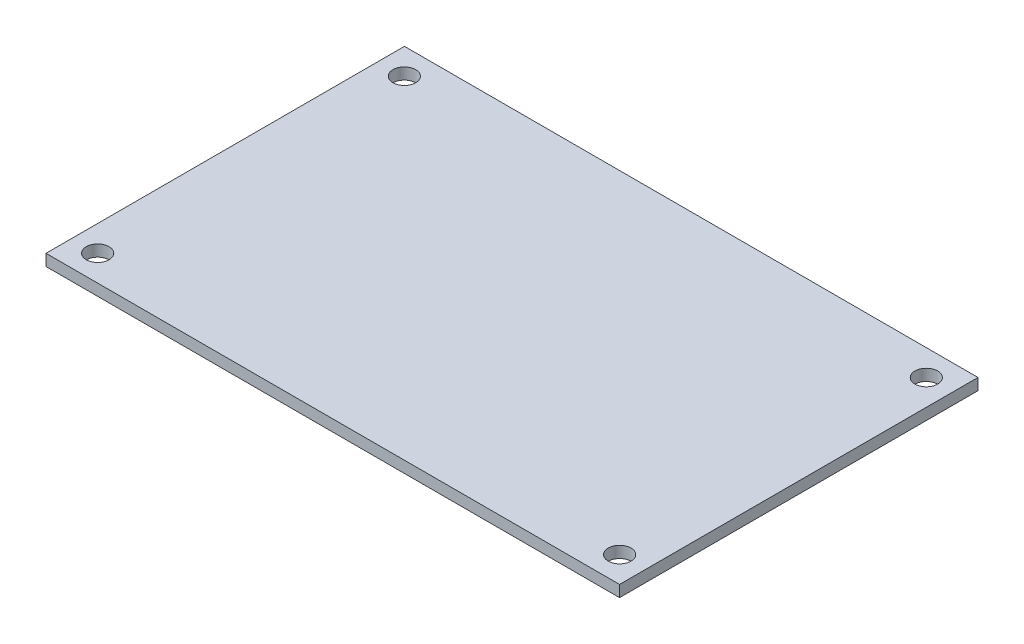
ISO-10303-21;
HEADER;
FILE_DESCRIPTION(('STEP AP214'),'2;1');
FILE_NAME('part.step','',(''),(''),'','','');
FILE_SCHEMA(('AUTOMOTIVE_DESIGN { 1 0 10303 214 1 1 1 1 }'));
ENDSEC;
DATA;
#1=APPLICATION_CONTEXT('core data for automotive mechanical design processes');
#2=APPLICATION_PROTOCOL_DEFINITION('international standard','automotive_design',2000,#1);
#3=PRODUCT_CONTEXT('',#1,'mechanical');
#4=PRODUCT('Part','Part','',(#3));
#5=PRODUCT_RELATED_PRODUCT_CATEGORY('part','',(#4));
#6=PRODUCT_DEFINITION_FORMATION('','',#4);
#7=PRODUCT_DEFINITION_CONTEXT('part definition',#1,'design');
#8=PRODUCT_DEFINITION('design','',#6,#7);
#9=PRODUCT_DEFINITION_SHAPE('','',#8);
#10=(LENGTH_UNIT() NAMED_UNIT(*) SI_UNIT(.MILLI.,.METRE.));
#11=(NAMED_UNIT(*) PLANE_ANGLE_UNIT() SI_UNIT($,.RADIAN.));
#12=(NAMED_UNIT(*) SI_UNIT($,.STERADIAN.) SOLID_ANGLE_UNIT());
#13=UNCERTAINTY_MEASURE_WITH_UNIT(LENGTH_MEASURE(1.E-05),#10,'distance_accuracy_value','');
#14=(GEOMETRIC_REPRESENTATION_CONTEXT(3) GLOBAL_UNCERTAINTY_ASSIGNED_CONTEXT((#13)) GLOBAL_UNIT_ASSIGNED_CONTEXT((#10,
#11,#12)) REPRESENTATION_CONTEXT('',''));
#15=CARTESIAN_POINT('',(0.,0.,0.));
#16=DIRECTION('',(0.,0.,1.));
#17=DIRECTION('',(1.,0.,0.));
#18=AXIS2_PLACEMENT_3D('',#15,#16,#17);
#19=CARTESIAN_POINT('',(40.,0.8001,-25.));
#20=DIRECTION('',(-1.,0.,0.));
#21=DIRECTION('',(0.,0.,1.));
#22=AXIS2_PLACEMENT_3D('',#19,#20,#21);
#23=PLANE('',#22);
#24=DIRECTION('',(0.,0.,-1.));
#25=VECTOR('',#24,1.);
#26=CARTESIAN_POINT('',(40.,-0.8001,-25.));
#27=LINE('',#26,#25);
#28=CARTESIAN_POINT('',(40.,-0.8001,25.));
#29=VERTEX_POINT('',#28);
#30=CARTESIAN_POINT('',(40.,-0.8001,-25.));
#31=VERTEX_POINT('',#30);
#32=EDGE_CURVE('E96',#29,#31,#27,.T.);
#33=ORIENTED_EDGE('',*,*,#32,.T.);
#34=DIRECTION('',(0.,-1.,0.));
#35=VECTOR('',#34,1.);
#36=CARTESIAN_POINT('',(40.,0.8001,-25.));
#37=LINE('',#36,#35);
#38=CARTESIAN_POINT('',(40.,0.8001,-25.));
#39=VERTEX_POINT('',#38);
#40=EDGE_CURVE('E11',#39,#31,#37,.T.);
#41=ORIENTED_EDGE('',*,*,#40,.F.);
#42=DIRECTION('',(0.,0.,-1.));
#43=VECTOR('',#42,1.);
#44=CARTESIAN_POINT('',(40.,0.8001,-25.));
#45=LINE('',#44,#43);
#46=CARTESIAN_POINT('',(40.,0.8001,25.));
#47=VERTEX_POINT('',#46);
#48=EDGE_CURVE('E84',#47,#39,#45,.T.);
#49=ORIENTED_EDGE('',*,*,#48,.F.);
#50=DIRECTION('',(0.,-1.,0.));
#51=VECTOR('',#50,1.);
#52=CARTESIAN_POINT('',(40.,0.8001,25.));
#53=LINE('',#52,#51);
#54=EDGE_CURVE('E92',#47,#29,#53,.T.);
#55=ORIENTED_EDGE('',*,*,#54,.T.);
#56=EDGE_LOOP('',(#33,#41,#49,#55));
#57=FACE_BOUND('',#56,.T.);
#58=ADVANCED_FACE('F33',(#57),#23,.F.);
#59=CARTESIAN_POINT('',(-40.,0.8001,-25.));
#60=DIRECTION('',(0.,0.,1.));
#61=DIRECTION('',(1.,0.,0.));
#62=AXIS2_PLACEMENT_3D('',#59,#60,#61);
#63=PLANE('',#62);
#64=DIRECTION('',(-1.,0.,0.));
#65=VECTOR('',#64,1.);
#66=CARTESIAN_POINT('',(-40.,-0.8001,-25.));
#67=LINE('',#66,#65);
#68=CARTESIAN_POINT('',(-40.,-0.8001,-25.));
#69=VERTEX_POINT('',#68);
#70=EDGE_CURVE('E88',#31,#69,#67,.T.);
#71=ORIENTED_EDGE('',*,*,#70,.T.);
#72=DIRECTION('',(0.,-1.,0.));
#73=VECTOR('',#72,1.);
#74=CARTESIAN_POINT('',(-40.,0.8001,-25.));
#75=LINE('',#74,#73);
#76=CARTESIAN_POINT('',(-40.,0.8001,-25.));
#77=VERTEX_POINT('',#76);
#78=EDGE_CURVE('E41',#77,#69,#75,.T.);
#79=ORIENTED_EDGE('',*,*,#78,.F.);
#80=DIRECTION('',(-1.,0.,0.));
#81=VECTOR('',#80,1.);
#82=CARTESIAN_POINT('',(-40.,0.8001,-25.));
#83=LINE('',#82,#81);
#84=EDGE_CURVE('E79',#39,#77,#83,.T.);
#85=ORIENTED_EDGE('',*,*,#84,.F.);
#86=ORIENTED_EDGE('',*,*,#40,.T.);
#87=EDGE_LOOP('',(#71,#79,#85,#86));
#88=FACE_BOUND('',#87,.T.);
#89=ADVANCED_FACE('F87',(#88),#63,.F.);
#90=CARTESIAN_POINT('',(-40.,0.8001,-25.));
#91=DIRECTION('',(1.,0.,0.));
#92=DIRECTION('',(0.,0.,-1.));
#93=AXIS2_PLACEMENT_3D('',#90,#91,#92);
#94=PLANE('',#93);
#95=DIRECTION('',(0.,0.,1.));
#96=VECTOR('',#95,1.);
#97=CARTESIAN_POINT('',(-40.,-0.8001,-25.));
#98=LINE('',#97,#96);
#99=CARTESIAN_POINT('',(-40.,-0.8001,25.));
#100=VERTEX_POINT('',#99);
#101=EDGE_CURVE('E66',#69,#100,#98,.T.);
#102=ORIENTED_EDGE('',*,*,#101,.T.);
#103=DIRECTION('',(0.,-1.,0.));
#104=VECTOR('',#103,1.);
#105=CARTESIAN_POINT('',(-40.,0.8001,25.));
#106=LINE('',#105,#104);
#107=CARTESIAN_POINT('',(-40.,0.8001,25.));
#108=VERTEX_POINT('',#107);
#109=EDGE_CURVE('E89',#108,#100,#106,.T.);
#110=ORIENTED_EDGE('',*,*,#109,.F.);
#111=DIRECTION('',(0.,0.,1.));
#112=VECTOR('',#111,1.);
#113=CARTESIAN_POINT('',(-40.,0.8001,-25.));
#114=LINE('',#113,#112);
#115=EDGE_CURVE('E82',#77,#108,#114,.T.);
#116=ORIENTED_EDGE('',*,*,#115,.F.);
#117=ORIENTED_EDGE('',*,*,#78,.T.);
#118=EDGE_LOOP('',(#102,#110,#116,#117));
#119=FACE_BOUND('',#118,.T.);
#120=ADVANCED_FACE('F90',(#119),#94,.F.);
#121=CARTESIAN_POINT('',(-40.,0.8001,25.));
#122=DIRECTION('',(0.,0.,-1.));
#123=DIRECTION('',(-1.,0.,0.));
#124=AXIS2_PLACEMENT_3D('',#121,#122,#123);
#125=PLANE('',#124);
#126=DIRECTION('',(1.,0.,0.));
#127=VECTOR('',#126,1.);
#128=CARTESIAN_POINT('',(-40.,-0.8001,25.));
#129=LINE('',#128,#127);
#130=EDGE_CURVE('E72',#100,#29,#129,.T.);
#131=ORIENTED_EDGE('',*,*,#130,.T.);
#132=ORIENTED_EDGE('',*,*,#54,.F.);
#133=DIRECTION('',(1.,0.,0.));
#134=VECTOR('',#133,1.);
#135=CARTESIAN_POINT('',(-40.,0.8001,25.));
#136=LINE('',#135,#134);
#137=EDGE_CURVE('E49',#108,#47,#136,.T.);
#138=ORIENTED_EDGE('',*,*,#137,.F.);
#139=ORIENTED_EDGE('',*,*,#109,.T.);
#140=EDGE_LOOP('',(#131,#132,#138,#139));
#141=FACE_BOUND('',#140,.T.);
#142=ADVANCED_FACE('F104',(#141),#125,.F.);
#143=CARTESIAN_POINT('',(0.,0.8001,0.));
#144=DIRECTION('',(0.,1.,0.));
#145=DIRECTION('',(0.,0.,1.));
#146=AXIS2_PLACEMENT_3D('',#143,#144,#145);
#147=PLANE('',#146);
#148=CARTESIAN_POINT('',(36.4028362102398,0.8001,-21.3874037701976));
#149=DIRECTION('',(0.,1.,0.));
#150=DIRECTION('',(0.,0.,1.));
#151=AXIS2_PLACEMENT_3D('',#148,#149,#150);
#152=CIRCLE('',#151,1.5875);
#153=CARTESIAN_POINT('',(36.4028362102398,0.8001,-19.7999037701976));
#154=VERTEX_POINT('',#153);
#155=EDGE_CURVE('E116',#154,#154,#152,.T.);
#156=ORIENTED_EDGE('',*,*,#155,.F.);
#157=EDGE_LOOP('',(#156));
#158=FACE_BOUND('',#157,.T.);
#159=CARTESIAN_POINT('',(36.4028362102398,0.8001,21.3874037701976));
#160=DIRECTION('',(0.,1.,0.));
#161=DIRECTION('',(0.,0.,1.));
#162=AXIS2_PLACEMENT_3D('',#159,#160,#161);
#163=CIRCLE('',#162,1.5875);
#164=CARTESIAN_POINT('',(36.4028362102398,0.8001,22.9749037701976));
#165=VERTEX_POINT('',#164);
#166=EDGE_CURVE('E122',#165,#165,#163,.T.);
#167=ORIENTED_EDGE('',*,*,#166,.F.);
#168=EDGE_LOOP('',(#167));
#169=FACE_BOUND('',#168,.T.);
#170=CARTESIAN_POINT('',(-36.4028362102398,0.8001,21.3874037701976));
#171=DIRECTION('',(0.,1.,0.));
#172=DIRECTION('',(0.,0.,1.));
#173=AXIS2_PLACEMENT_3D('',#170,#171,#172);
#174=CIRCLE('',#173,1.5875);
#175=CARTESIAN_POINT('',(-36.4028362102398,0.8001,22.9749037701976));
#176=VERTEX_POINT('',#175);
#177=EDGE_CURVE('E128',#176,#176,#174,.T.);
#178=ORIENTED_EDGE('',*,*,#177,.F.);
#179=EDGE_LOOP('',(#178));
#180=FACE_BOUND('',#179,.T.);
#181=CARTESIAN_POINT('',(-36.4028362102398,0.8001,-21.3874037701976));
#182=DIRECTION('',(0.,1.,0.));
#183=DIRECTION('',(0.,0.,1.));
#184=AXIS2_PLACEMENT_3D('',#181,#182,#183);
#185=CIRCLE('',#184,1.5875);
#186=CARTESIAN_POINT('',(-36.4028362102398,0.8001,-19.7999037701976));
#187=VERTEX_POINT('',#186);
#188=EDGE_CURVE('E110',#187,#187,#185,.T.);
#189=ORIENTED_EDGE('',*,*,#188,.F.);
#190=EDGE_LOOP('',(#189));
#191=FACE_BOUND('',#190,.T.);
#192=ORIENTED_EDGE('',*,*,#48,.T.);
#193=ORIENTED_EDGE('',*,*,#84,.T.);
#194=ORIENTED_EDGE('',*,*,#115,.T.);
#195=ORIENTED_EDGE('',*,*,#137,.T.);
#196=EDGE_LOOP('',(#192,#193,#194,#195));
#197=FACE_BOUND('',#196,.T.);
#198=ADVANCED_FACE('F80',(#158,#169,#180,#191,#197),#147,.T.);
#199=CARTESIAN_POINT('',(0.,-0.8001,0.));
#200=DIRECTION('',(0.,1.,0.));
#201=DIRECTION('',(0.,0.,1.));
#202=AXIS2_PLACEMENT_3D('',#199,#200,#201);
#203=PLANE('',#202);
#204=CARTESIAN_POINT('',(36.4028362102398,-0.8001,-21.3874037701976));
#205=DIRECTION('',(0.,1.,0.));
#206=DIRECTION('',(0.,0.,1.));
#207=AXIS2_PLACEMENT_3D('',#204,#205,#206);
#208=CIRCLE('',#207,1.5875);
#209=CARTESIAN_POINT('',(36.4028362102398,-0.8001,-19.7999037701976));
#210=VERTEX_POINT('',#209);
#211=EDGE_CURVE('E119',#210,#210,#208,.T.);
#212=ORIENTED_EDGE('',*,*,#211,.T.);
#213=EDGE_LOOP('',(#212));
#214=FACE_BOUND('',#213,.T.);
#215=CARTESIAN_POINT('',(36.4028362102398,-0.8001,21.3874037701976));
#216=DIRECTION('',(0.,1.,0.));
#217=DIRECTION('',(0.,0.,1.));
#218=AXIS2_PLACEMENT_3D('',#215,#216,#217);
#219=CIRCLE('',#218,1.5875);
#220=CARTESIAN_POINT('',(36.4028362102398,-0.8001,22.9749037701976));
#221=VERTEX_POINT('',#220);
#222=EDGE_CURVE('E125',#221,#221,#219,.T.);
#223=ORIENTED_EDGE('',*,*,#222,.T.);
#224=EDGE_LOOP('',(#223));
#225=FACE_BOUND('',#224,.T.);
#226=CARTESIAN_POINT('',(-36.4028362102398,-0.8001,21.3874037701976));
#227=DIRECTION('',(0.,1.,0.));
#228=DIRECTION('',(0.,0.,1.));
#229=AXIS2_PLACEMENT_3D('',#226,#227,#228);
#230=CIRCLE('',#229,1.5875);
#231=CARTESIAN_POINT('',(-36.4028362102398,-0.8001,22.9749037701976));
#232=VERTEX_POINT('',#231);
#233=EDGE_CURVE('E113',#232,#232,#230,.T.);
#234=ORIENTED_EDGE('',*,*,#233,.T.);
#235=EDGE_LOOP('',(#234));
#236=FACE_BOUND('',#235,.T.);
#237=CARTESIAN_POINT('',(-36.4028362102398,-0.8001,-21.3874037701976));
#238=DIRECTION('',(0.,1.,0.));
#239=DIRECTION('',(0.,0.,1.));
#240=AXIS2_PLACEMENT_3D('',#237,#238,#239);
#241=CIRCLE('',#240,1.5875);
#242=CARTESIAN_POINT('',(-36.4028362102398,-0.8001,-19.7999037701976));
#243=VERTEX_POINT('',#242);
#244=EDGE_CURVE('E99',#243,#243,#241,.T.);
#245=ORIENTED_EDGE('',*,*,#244,.T.);
#246=EDGE_LOOP('',(#245));
#247=FACE_BOUND('',#246,.T.);
#248=ORIENTED_EDGE('',*,*,#32,.F.);
#249=ORIENTED_EDGE('',*,*,#130,.F.);
#250=ORIENTED_EDGE('',*,*,#101,.F.);
#251=ORIENTED_EDGE('',*,*,#70,.F.);
#252=EDGE_LOOP('',(#248,#249,#250,#251));
#253=FACE_BOUND('',#252,.T.);
#254=ADVANCED_FACE('F107',(#214,#225,#236,#247,#253),#203,.F.);
#255=CARTESIAN_POINT('',(-36.4028362102398,-0.8001,-21.3874037701976));
#256=DIRECTION('',(0.,1.,0.));
#257=DIRECTION('',(0.,0.,1.));
#258=AXIS2_PLACEMENT_3D('',#255,#256,#257);
#259=CYLINDRICAL_SURFACE('',#258,1.5875);
#260=ORIENTED_EDGE('',*,*,#244,.F.);
#261=EDGE_LOOP('',(#260));
#262=FACE_BOUND('',#261,.T.);
#263=ORIENTED_EDGE('',*,*,#188,.T.);
#264=EDGE_LOOP('',(#263));
#265=FACE_BOUND('',#264,.T.);
#266=ADVANCED_FACE('F140',(#262,#265),#259,.F.);
#267=CARTESIAN_POINT('',(-36.4028362102398,-0.8001,21.3874037701976));
#268=DIRECTION('',(0.,1.,0.));
#269=DIRECTION('',(0.,0.,1.));
#270=AXIS2_PLACEMENT_3D('',#267,#268,#269);
#271=CYLINDRICAL_SURFACE('',#270,1.5875);
#272=ORIENTED_EDGE('',*,*,#233,.F.);
#273=EDGE_LOOP('',(#272));
#274=FACE_BOUND('',#273,.T.);
#275=ORIENTED_EDGE('',*,*,#177,.T.);
#276=EDGE_LOOP('',(#275));
#277=FACE_BOUND('',#276,.T.);
#278=ADVANCED_FACE('F136',(#274,#277),#271,.F.);
#279=CARTESIAN_POINT('',(36.4028362102398,-0.8001,21.3874037701976));
#280=DIRECTION('',(0.,1.,0.));
#281=DIRECTION('',(0.,0.,1.));
#282=AXIS2_PLACEMENT_3D('',#279,#280,#281);
#283=CYLINDRICAL_SURFACE('',#282,1.5875);
#284=ORIENTED_EDGE('',*,*,#222,.F.);
#285=EDGE_LOOP('',(#284));
#286=FACE_BOUND('',#285,.T.);
#287=ORIENTED_EDGE('',*,*,#166,.T.);
#288=EDGE_LOOP('',(#287));
#289=FACE_BOUND('',#288,.T.);
#290=ADVANCED_FACE('F139',(#286,#289),#283,.F.);
#291=CARTESIAN_POINT('',(36.4028362102398,-0.8001,-21.3874037701976));
#292=DIRECTION('',(0.,1.,0.));
#293=DIRECTION('',(0.,0.,1.));
#294=AXIS2_PLACEMENT_3D('',#291,#292,#293);
#295=CYLINDRICAL_SURFACE('',#294,1.5875);
#296=ORIENTED_EDGE('',*,*,#211,.F.);
#297=EDGE_LOOP('',(#296));
#298=FACE_BOUND('',#297,.T.);
#299=ORIENTED_EDGE('',*,*,#155,.T.);
#300=EDGE_LOOP('',(#299));
#301=FACE_BOUND('',#300,.T.);
#302=ADVANCED_FACE('F201',(#298,#301),#295,.F.);
#303=CLOSED_SHELL('',(#58,#89,#120,#142,#198,#254,#266,#278,#290,#302));
#304=MANIFOLD_SOLID_BREP('B2',#303);
#305=ADVANCED_BREP_SHAPE_REPRESENTATION('',(#18,#304),#14);
#306=SHAPE_DEFINITION_REPRESENTATION(#9,#305);
ENDSEC;
END-ISO-10303-21;
